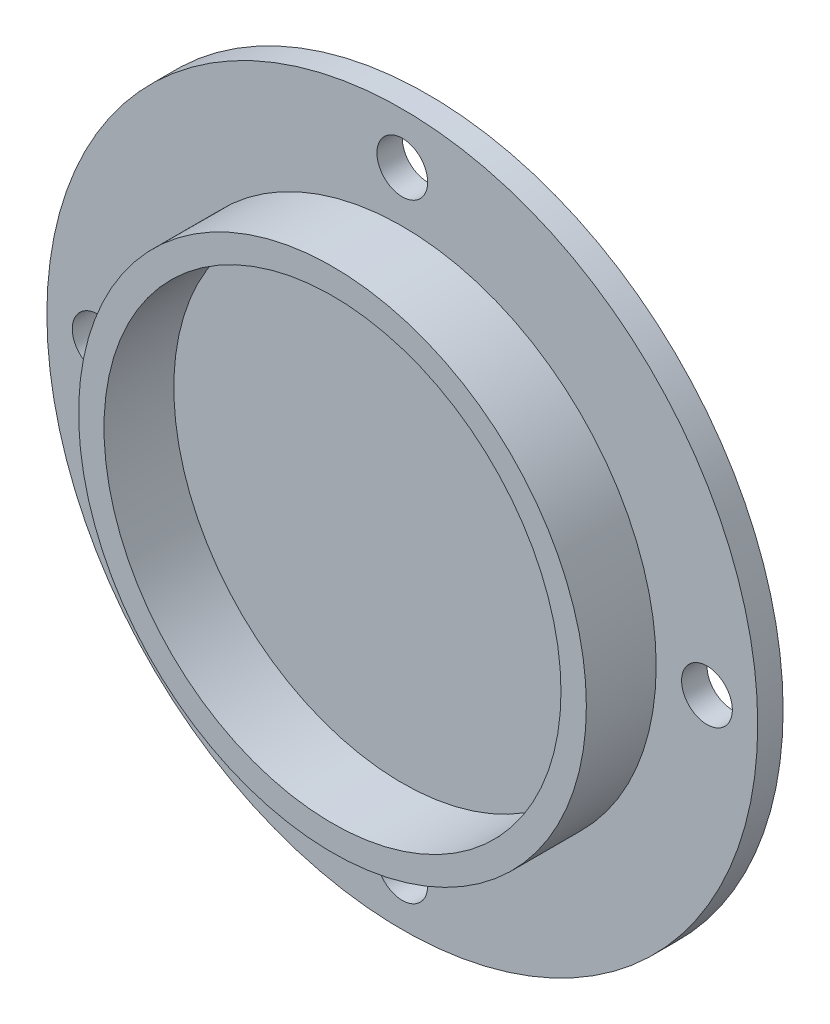
ISO-10303-21;
HEADER;
FILE_DESCRIPTION(('STEP AP214'),'2;1');
FILE_NAME('part.step','',(''),(''),'','','');
FILE_SCHEMA(('AUTOMOTIVE_DESIGN { 1 0 10303 214 1 1 1 1 }'));
ENDSEC;
DATA;
#1=APPLICATION_CONTEXT('core data for automotive mechanical design processes');
#2=APPLICATION_PROTOCOL_DEFINITION('international standard','automotive_design',2000,#1);
#3=PRODUCT_CONTEXT('',#1,'mechanical');
#4=PRODUCT('Part','Part','',(#3));
#5=PRODUCT_RELATED_PRODUCT_CATEGORY('part','',(#4));
#6=PRODUCT_DEFINITION_FORMATION('','',#4);
#7=PRODUCT_DEFINITION_CONTEXT('part definition',#1,'design');
#8=PRODUCT_DEFINITION('design','',#6,#7);
#9=PRODUCT_DEFINITION_SHAPE('','',#8);
#10=(LENGTH_UNIT() NAMED_UNIT(*) SI_UNIT(.MILLI.,.METRE.));
#11=(NAMED_UNIT(*) PLANE_ANGLE_UNIT() SI_UNIT($,.RADIAN.));
#12=(NAMED_UNIT(*) SI_UNIT($,.STERADIAN.) SOLID_ANGLE_UNIT());
#13=UNCERTAINTY_MEASURE_WITH_UNIT(LENGTH_MEASURE(1.E-05),#10,'distance_accuracy_value','');
#14=(GEOMETRIC_REPRESENTATION_CONTEXT(3) GLOBAL_UNCERTAINTY_ASSIGNED_CONTEXT((#13)) GLOBAL_UNIT_ASSIGNED_CONTEXT((#10,
#11,#12)) REPRESENTATION_CONTEXT('',''));
#15=CARTESIAN_POINT('',(0.,0.,0.));
#16=DIRECTION('',(0.,0.,1.));
#17=DIRECTION('',(1.,0.,0.));
#18=AXIS2_PLACEMENT_3D('',#15,#16,#17);
#19=CARTESIAN_POINT('',(0.,0.,10.));
#20=DIRECTION('',(0.,0.,1.));
#21=DIRECTION('',(1.,0.,0.));
#22=AXIS2_PLACEMENT_3D('',#19,#20,#21);
#23=PLANE('',#22);
#24=CARTESIAN_POINT('',(120.,0.,10.));
#25=DIRECTION('',(0.,0.,1.));
#26=DIRECTION('',(1.,0.,0.));
#27=AXIS2_PLACEMENT_3D('',#24,#25,#26);
#28=CIRCLE('',#27,10.);
#29=CARTESIAN_POINT('',(130.,0.,10.));
#30=VERTEX_POINT('',#29);
#31=EDGE_CURVE('E59',#30,#30,#28,.T.);
#32=ORIENTED_EDGE('',*,*,#31,.F.);
#33=EDGE_LOOP('',(#32));
#34=FACE_BOUND('',#33,.T.);
#35=CARTESIAN_POINT('',(0.,120.,10.));
#36=DIRECTION('',(0.,0.,1.));
#37=DIRECTION('',(1.,0.,0.));
#38=AXIS2_PLACEMENT_3D('',#35,#36,#37);
#39=CIRCLE('',#38,10.);
#40=CARTESIAN_POINT('',(10.,120.,10.));
#41=VERTEX_POINT('',#40);
#42=EDGE_CURVE('E45',#41,#41,#39,.T.);
#43=ORIENTED_EDGE('',*,*,#42,.F.);
#44=EDGE_LOOP('',(#43));
#45=FACE_BOUND('',#44,.T.);
#46=CARTESIAN_POINT('',(0.,0.,10.));
#47=DIRECTION('',(0.,0.,1.));
#48=DIRECTION('',(1.,0.,0.));
#49=AXIS2_PLACEMENT_3D('',#46,#47,#48);
#50=CIRCLE('',#49,140.);
#51=CARTESIAN_POINT('',(140.,0.,10.));
#52=VERTEX_POINT('',#51);
#53=EDGE_CURVE('E37',#52,#52,#50,.T.);
#54=ORIENTED_EDGE('',*,*,#53,.T.);
#55=EDGE_LOOP('',(#54));
#56=FACE_BOUND('',#55,.T.);
#57=CARTESIAN_POINT('',(-120.,0.,10.));
#58=DIRECTION('',(0.,0.,1.));
#59=DIRECTION('',(1.,0.,0.));
#60=AXIS2_PLACEMENT_3D('',#57,#58,#59);
#61=CIRCLE('',#60,9.99999999999999);
#62=CARTESIAN_POINT('',(-110.,0.,10.));
#63=VERTEX_POINT('',#62);
#64=EDGE_CURVE('E53',#63,#63,#61,.T.);
#65=ORIENTED_EDGE('',*,*,#64,.F.);
#66=EDGE_LOOP('',(#65));
#67=FACE_BOUND('',#66,.T.);
#68=CARTESIAN_POINT('',(0.,-120.,10.));
#69=DIRECTION('',(0.,0.,1.));
#70=DIRECTION('',(1.,0.,0.));
#71=AXIS2_PLACEMENT_3D('',#68,#69,#70);
#72=CIRCLE('',#71,10.);
#73=CARTESIAN_POINT('',(10.,-120.,10.));
#74=VERTEX_POINT('',#73);
#75=EDGE_CURVE('E65',#74,#74,#72,.T.);
#76=ORIENTED_EDGE('',*,*,#75,.F.);
#77=EDGE_LOOP('',(#76));
#78=FACE_BOUND('',#77,.T.);
#79=CARTESIAN_POINT('',(0.,0.,10.));
#80=DIRECTION('',(0.,0.,1.));
#81=DIRECTION('',(1.,0.,0.));
#82=AXIS2_PLACEMENT_3D('',#79,#80,#81);
#83=CIRCLE('',#82,100.);
#84=CARTESIAN_POINT('',(100.,0.,10.));
#85=VERTEX_POINT('',#84);
#86=EDGE_CURVE('E74',#85,#85,#83,.T.);
#87=ORIENTED_EDGE('',*,*,#86,.F.);
#88=EDGE_LOOP('',(#87));
#89=FACE_BOUND('',#88,.T.);
#90=ADVANCED_FACE('F30',(#34,#45,#56,#67,#78,#89),#23,.T.);
#91=CARTESIAN_POINT('',(0.,0.,0.));
#92=DIRECTION('',(0.,0.,1.));
#93=DIRECTION('',(1.,0.,0.));
#94=AXIS2_PLACEMENT_3D('',#91,#92,#93);
#95=PLANE('',#94);
#96=CARTESIAN_POINT('',(120.,0.,0.));
#97=DIRECTION('',(0.,0.,1.));
#98=DIRECTION('',(1.,0.,0.));
#99=AXIS2_PLACEMENT_3D('',#96,#97,#98);
#100=CIRCLE('',#99,10.);
#101=CARTESIAN_POINT('',(130.,0.,0.));
#102=VERTEX_POINT('',#101);
#103=EDGE_CURVE('E62',#102,#102,#100,.T.);
#104=ORIENTED_EDGE('',*,*,#103,.T.);
#105=EDGE_LOOP('',(#104));
#106=FACE_BOUND('',#105,.T.);
#107=CARTESIAN_POINT('',(0.,120.,0.));
#108=DIRECTION('',(0.,0.,1.));
#109=DIRECTION('',(1.,0.,0.));
#110=AXIS2_PLACEMENT_3D('',#107,#108,#109);
#111=CIRCLE('',#110,10.);
#112=CARTESIAN_POINT('',(10.,120.,0.));
#113=VERTEX_POINT('',#112);
#114=EDGE_CURVE('E50',#113,#113,#111,.T.);
#115=ORIENTED_EDGE('',*,*,#114,.T.);
#116=EDGE_LOOP('',(#115));
#117=FACE_BOUND('',#116,.T.);
#118=CARTESIAN_POINT('',(0.,0.,0.));
#119=DIRECTION('',(0.,0.,1.));
#120=DIRECTION('',(1.,0.,0.));
#121=AXIS2_PLACEMENT_3D('',#118,#119,#120);
#122=CIRCLE('',#121,140.);
#123=CARTESIAN_POINT('',(140.,0.,0.));
#124=VERTEX_POINT('',#123);
#125=EDGE_CURVE('E41',#124,#124,#122,.T.);
#126=ORIENTED_EDGE('',*,*,#125,.F.);
#127=EDGE_LOOP('',(#126));
#128=FACE_BOUND('',#127,.T.);
#129=CARTESIAN_POINT('',(-120.,0.,0.));
#130=DIRECTION('',(0.,0.,1.));
#131=DIRECTION('',(1.,0.,0.));
#132=AXIS2_PLACEMENT_3D('',#129,#130,#131);
#133=CIRCLE('',#132,9.99999999999999);
#134=CARTESIAN_POINT('',(-110.,0.,0.));
#135=VERTEX_POINT('',#134);
#136=EDGE_CURVE('E56',#135,#135,#133,.T.);
#137=ORIENTED_EDGE('',*,*,#136,.T.);
#138=EDGE_LOOP('',(#137));
#139=FACE_BOUND('',#138,.T.);
#140=CARTESIAN_POINT('',(0.,-120.,0.));
#141=DIRECTION('',(0.,0.,1.));
#142=DIRECTION('',(1.,0.,0.));
#143=AXIS2_PLACEMENT_3D('',#140,#141,#142);
#144=CIRCLE('',#143,10.);
#145=CARTESIAN_POINT('',(10.,-120.,0.));
#146=VERTEX_POINT('',#145);
#147=EDGE_CURVE('E68',#146,#146,#144,.T.);
#148=ORIENTED_EDGE('',*,*,#147,.T.);
#149=EDGE_LOOP('',(#148));
#150=FACE_BOUND('',#149,.T.);
#151=ADVANCED_FACE('F100',(#106,#117,#128,#139,#150),#95,.F.);
#152=CARTESIAN_POINT('',(0.,0.,10.));
#153=DIRECTION('',(0.,0.,-1.));
#154=DIRECTION('',(-1.,0.,0.));
#155=AXIS2_PLACEMENT_3D('',#152,#153,#154);
#156=CYLINDRICAL_SURFACE('',#155,140.);
#157=ORIENTED_EDGE('',*,*,#53,.F.);
#158=EDGE_LOOP('',(#157));
#159=FACE_BOUND('',#158,.T.);
#160=ORIENTED_EDGE('',*,*,#125,.T.);
#161=EDGE_LOOP('',(#160));
#162=FACE_BOUND('',#161,.T.);
#163=ADVANCED_FACE('F32',(#159,#162),#156,.T.);
#164=CARTESIAN_POINT('',(0.,120.,10.));
#165=DIRECTION('',(0.,0.,-1.));
#166=DIRECTION('',(-1.,0.,0.));
#167=AXIS2_PLACEMENT_3D('',#164,#165,#166);
#168=CYLINDRICAL_SURFACE('',#167,10.);
#169=ORIENTED_EDGE('',*,*,#42,.T.);
#170=EDGE_LOOP('',(#169));
#171=FACE_BOUND('',#170,.T.);
#172=ORIENTED_EDGE('',*,*,#114,.F.);
#173=EDGE_LOOP('',(#172));
#174=FACE_BOUND('',#173,.T.);
#175=ADVANCED_FACE('F154',(#171,#174),#168,.F.);
#176=CARTESIAN_POINT('',(-120.,0.,10.));
#177=DIRECTION('',(0.,0.,-1.));
#178=DIRECTION('',(-1.,0.,0.));
#179=AXIS2_PLACEMENT_3D('',#176,#177,#178);
#180=CYLINDRICAL_SURFACE('',#179,9.99999999999999);
#181=ORIENTED_EDGE('',*,*,#64,.T.);
#182=EDGE_LOOP('',(#181));
#183=FACE_BOUND('',#182,.T.);
#184=ORIENTED_EDGE('',*,*,#136,.F.);
#185=EDGE_LOOP('',(#184));
#186=FACE_BOUND('',#185,.T.);
#187=ADVANCED_FACE('F144',(#183,#186),#180,.F.);
#188=CARTESIAN_POINT('',(120.,0.,10.));
#189=DIRECTION('',(0.,0.,-1.));
#190=DIRECTION('',(-1.,0.,0.));
#191=AXIS2_PLACEMENT_3D('',#188,#189,#190);
#192=CYLINDRICAL_SURFACE('',#191,10.);
#193=ORIENTED_EDGE('',*,*,#31,.T.);
#194=EDGE_LOOP('',(#193));
#195=FACE_BOUND('',#194,.T.);
#196=ORIENTED_EDGE('',*,*,#103,.F.);
#197=EDGE_LOOP('',(#196));
#198=FACE_BOUND('',#197,.T.);
#199=ADVANCED_FACE('F95',(#195,#198),#192,.F.);
#200=CARTESIAN_POINT('',(0.,-120.,10.));
#201=DIRECTION('',(0.,0.,-1.));
#202=DIRECTION('',(-1.,0.,0.));
#203=AXIS2_PLACEMENT_3D('',#200,#201,#202);
#204=CYLINDRICAL_SURFACE('',#203,10.);
#205=ORIENTED_EDGE('',*,*,#75,.T.);
#206=EDGE_LOOP('',(#205));
#207=FACE_BOUND('',#206,.T.);
#208=ORIENTED_EDGE('',*,*,#147,.F.);
#209=EDGE_LOOP('',(#208));
#210=FACE_BOUND('',#209,.T.);
#211=ADVANCED_FACE('F86',(#207,#210),#204,.F.);
#212=CARTESIAN_POINT('',(0.,0.,37.5));
#213=DIRECTION('',(0.,0.,1.));
#214=DIRECTION('',(1.,0.,0.));
#215=AXIS2_PLACEMENT_3D('',#212,#213,#214);
#216=PLANE('',#215);
#217=CARTESIAN_POINT('',(0.,0.,37.5));
#218=DIRECTION('',(0.,0.,1.));
#219=DIRECTION('',(1.,0.,0.));
#220=AXIS2_PLACEMENT_3D('',#217,#218,#219);
#221=CIRCLE('',#220,100.);
#222=CARTESIAN_POINT('',(100.,0.,37.5));
#223=VERTEX_POINT('',#222);
#224=EDGE_CURVE('E71',#223,#223,#221,.T.);
#225=ORIENTED_EDGE('',*,*,#224,.T.);
#226=EDGE_LOOP('',(#225));
#227=FACE_BOUND('',#226,.T.);
#228=CARTESIAN_POINT('',(0.,0.,37.5));
#229=DIRECTION('',(0.,0.,1.));
#230=DIRECTION('',(1.,0.,0.));
#231=AXIS2_PLACEMENT_3D('',#228,#229,#230);
#232=CIRCLE('',#231,90.);
#233=CARTESIAN_POINT('',(90.,0.,37.5));
#234=VERTEX_POINT('',#233);
#235=EDGE_CURVE('E77',#234,#234,#232,.T.);
#236=ORIENTED_EDGE('',*,*,#235,.F.);
#237=EDGE_LOOP('',(#236));
#238=FACE_BOUND('',#237,.T.);
#239=ADVANCED_FACE('F83',(#227,#238),#216,.T.);
#240=CARTESIAN_POINT('',(0.,0.,37.5));
#241=DIRECTION('',(0.,0.,-1.));
#242=DIRECTION('',(-1.,0.,0.));
#243=AXIS2_PLACEMENT_3D('',#240,#241,#242);
#244=CYLINDRICAL_SURFACE('',#243,100.);
#245=ORIENTED_EDGE('',*,*,#224,.F.);
#246=EDGE_LOOP('',(#245));
#247=FACE_BOUND('',#246,.T.);
#248=ORIENTED_EDGE('',*,*,#86,.T.);
#249=EDGE_LOOP('',(#248));
#250=FACE_BOUND('',#249,.T.);
#251=ADVANCED_FACE('F85',(#247,#250),#244,.T.);
#252=CARTESIAN_POINT('',(0.,0.,37.5));
#253=DIRECTION('',(0.,0.,-1.));
#254=DIRECTION('',(-1.,0.,0.));
#255=AXIS2_PLACEMENT_3D('',#252,#253,#254);
#256=CYLINDRICAL_SURFACE('',#255,90.);
#257=ORIENTED_EDGE('',*,*,#235,.T.);
#258=EDGE_LOOP('',(#257));
#259=FACE_BOUND('',#258,.T.);
#260=CARTESIAN_POINT('',(0.,0.,10.));
#261=DIRECTION('',(0.,0.,1.));
#262=DIRECTION('',(1.,0.,0.));
#263=AXIS2_PLACEMENT_3D('',#260,#261,#262);
#264=CIRCLE('',#263,90.);
#265=CARTESIAN_POINT('',(90.,0.,10.));
#266=VERTEX_POINT('',#265);
#267=EDGE_CURVE('E10',#266,#266,#264,.F.);
#268=ORIENTED_EDGE('',*,*,#267,.T.);
#269=EDGE_LOOP('',(#268));
#270=FACE_BOUND('',#269,.T.);
#271=ADVANCED_FACE('F81',(#259,#270),#256,.F.);
#272=ORIENTED_EDGE('',*,*,#267,.F.);
#273=EDGE_LOOP('',(#272));
#274=FACE_BOUND('',#273,.T.);
#275=ADVANCED_FACE('F102',(#274),#23,.T.);
#276=CLOSED_SHELL('',(#90,#151,#163,#175,#187,#199,#211,#239,#251,#271,#275));
#277=MANIFOLD_SOLID_BREP('B2',#276);
#278=ADVANCED_BREP_SHAPE_REPRESENTATION('',(#18,#277),#14);
#279=SHAPE_DEFINITION_REPRESENTATION(#9,#278);
ENDSEC;
END-ISO-10303-21;
